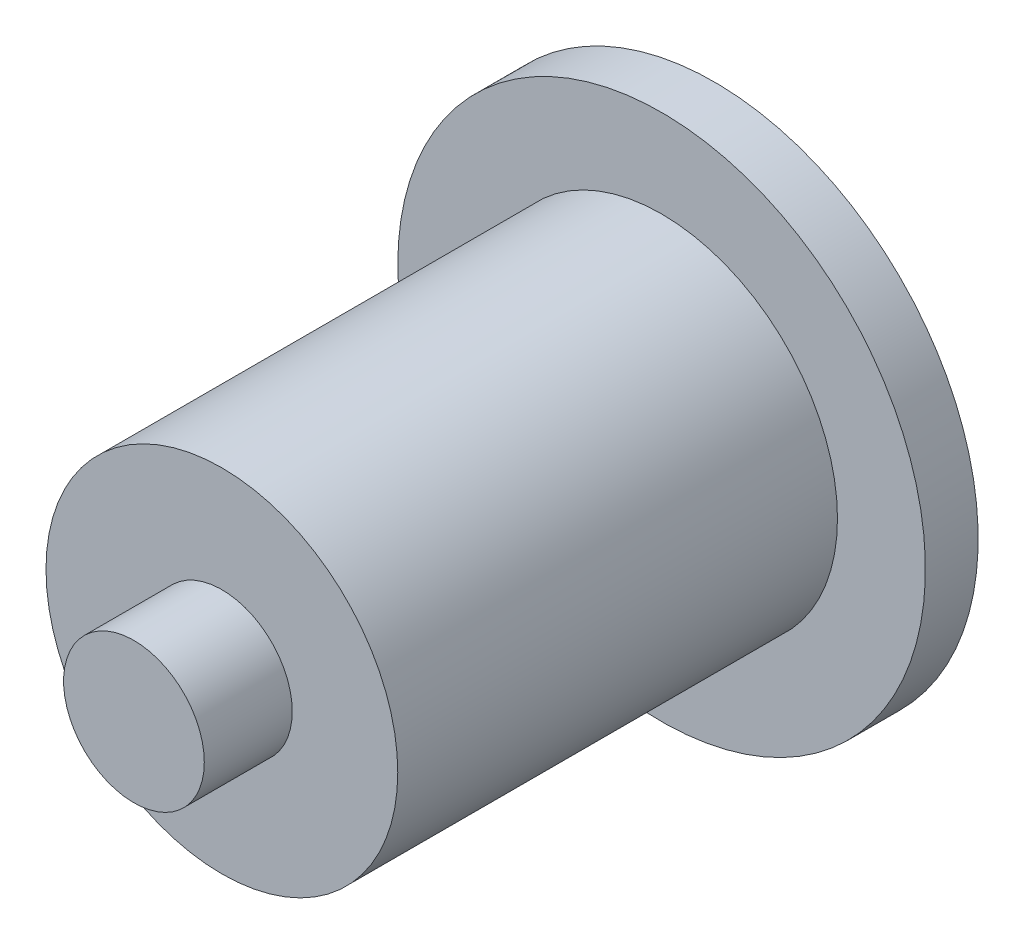
ISO-10303-21;
HEADER;
FILE_DESCRIPTION(('STEP AP214'),'2;1');
FILE_NAME('part.step','',(''),(''),'','','');
FILE_SCHEMA(('AUTOMOTIVE_DESIGN { 1 0 10303 214 1 1 1 1 }'));
ENDSEC;
DATA;
#1=APPLICATION_CONTEXT('core data for automotive mechanical design processes');
#2=APPLICATION_PROTOCOL_DEFINITION('international standard','automotive_design',2000,#1);
#3=PRODUCT_CONTEXT('',#1,'mechanical');
#4=PRODUCT('Part','Part','',(#3));
#5=PRODUCT_RELATED_PRODUCT_CATEGORY('part','',(#4));
#6=PRODUCT_DEFINITION_FORMATION('','',#4);
#7=PRODUCT_DEFINITION_CONTEXT('part definition',#1,'design');
#8=PRODUCT_DEFINITION('design','',#6,#7);
#9=PRODUCT_DEFINITION_SHAPE('','',#8);
#10=(LENGTH_UNIT() NAMED_UNIT(*) SI_UNIT(.MILLI.,.METRE.));
#11=(NAMED_UNIT(*) PLANE_ANGLE_UNIT() SI_UNIT($,.RADIAN.));
#12=(NAMED_UNIT(*) SI_UNIT($,.STERADIAN.) SOLID_ANGLE_UNIT());
#13=UNCERTAINTY_MEASURE_WITH_UNIT(LENGTH_MEASURE(1.E-05),#10,'distance_accuracy_value','');
#14=(GEOMETRIC_REPRESENTATION_CONTEXT(3) GLOBAL_UNCERTAINTY_ASSIGNED_CONTEXT((#13)) GLOBAL_UNIT_ASSIGNED_CONTEXT((#10,
#11,#12)) REPRESENTATION_CONTEXT('',''));
#15=CARTESIAN_POINT('',(0.,0.,0.));
#16=DIRECTION('',(0.,0.,1.));
#17=DIRECTION('',(1.,0.,0.));
#18=AXIS2_PLACEMENT_3D('',#15,#16,#17);
#19=CARTESIAN_POINT('',(0.,0.,25.));
#20=DIRECTION('',(0.,0.,-1.));
#21=DIRECTION('',(-1.,0.,0.));
#22=AXIS2_PLACEMENT_3D('',#19,#20,#21);
#23=CYLINDRICAL_SURFACE('',#22,10.);
#24=CARTESIAN_POINT('',(0.,0.,25.));
#25=DIRECTION('',(0.,0.,1.));
#26=DIRECTION('',(1.,0.,0.));
#27=AXIS2_PLACEMENT_3D('',#24,#25,#26);
#28=CIRCLE('',#27,10.);
#29=CARTESIAN_POINT('',(10.,0.,25.));
#30=VERTEX_POINT('',#29);
#31=EDGE_CURVE('E10',#30,#30,#28,.T.);
#32=ORIENTED_EDGE('',*,*,#31,.F.);
#33=EDGE_LOOP('',(#32));
#34=FACE_BOUND('',#33,.T.);
#35=CARTESIAN_POINT('',(0.,0.,0.));
#36=DIRECTION('',(0.,0.,-1.));
#37=DIRECTION('',(-1.,0.,0.));
#38=AXIS2_PLACEMENT_3D('',#35,#36,#37);
#39=CIRCLE('',#38,10.);
#40=CARTESIAN_POINT('',(-10.,0.,0.));
#41=VERTEX_POINT('',#40);
#42=EDGE_CURVE('E45',#41,#41,#39,.T.);
#43=ORIENTED_EDGE('',*,*,#42,.F.);
#44=EDGE_LOOP('',(#43));
#45=FACE_BOUND('',#44,.T.);
#46=ADVANCED_FACE('F30',(#34,#45),#23,.T.);
#47=CARTESIAN_POINT('',(0.,0.,25.));
#48=DIRECTION('',(0.,0.,1.));
#49=DIRECTION('',(1.,0.,0.));
#50=AXIS2_PLACEMENT_3D('',#47,#48,#49);
#51=PLANE('',#50);
#52=CARTESIAN_POINT('',(0.,0.,25.));
#53=DIRECTION('',(0.,0.,1.));
#54=DIRECTION('',(1.,0.,0.));
#55=AXIS2_PLACEMENT_3D('',#52,#53,#54);
#56=CIRCLE('',#55,4.);
#57=CARTESIAN_POINT('',(4.,0.,25.));
#58=VERTEX_POINT('',#57);
#59=EDGE_CURVE('E40',#58,#58,#56,.T.);
#60=ORIENTED_EDGE('',*,*,#59,.F.);
#61=EDGE_LOOP('',(#60));
#62=FACE_BOUND('',#61,.T.);
#63=ORIENTED_EDGE('',*,*,#31,.T.);
#64=EDGE_LOOP('',(#63));
#65=FACE_BOUND('',#64,.T.);
#66=ADVANCED_FACE('F74',(#62,#65),#51,.T.);
#67=CARTESIAN_POINT('',(0.,0.,30.));
#68=DIRECTION('',(0.,0.,-1.));
#69=DIRECTION('',(-1.,0.,0.));
#70=AXIS2_PLACEMENT_3D('',#67,#68,#69);
#71=CYLINDRICAL_SURFACE('',#70,4.);
#72=CARTESIAN_POINT('',(0.,0.,30.));
#73=DIRECTION('',(0.,0.,1.));
#74=DIRECTION('',(1.,0.,0.));
#75=AXIS2_PLACEMENT_3D('',#72,#73,#74);
#76=CIRCLE('',#75,4.);
#77=CARTESIAN_POINT('',(4.,0.,30.));
#78=VERTEX_POINT('',#77);
#79=EDGE_CURVE('E36',#78,#78,#76,.T.);
#80=ORIENTED_EDGE('',*,*,#79,.F.);
#81=EDGE_LOOP('',(#80));
#82=FACE_BOUND('',#81,.T.);
#83=ORIENTED_EDGE('',*,*,#59,.T.);
#84=EDGE_LOOP('',(#83));
#85=FACE_BOUND('',#84,.T.);
#86=ADVANCED_FACE('F79',(#82,#85),#71,.T.);
#87=CARTESIAN_POINT('',(0.,0.,30.));
#88=DIRECTION('',(0.,0.,1.));
#89=DIRECTION('',(1.,0.,0.));
#90=AXIS2_PLACEMENT_3D('',#87,#88,#89);
#91=PLANE('',#90);
#92=ORIENTED_EDGE('',*,*,#79,.T.);
#93=EDGE_LOOP('',(#92));
#94=FACE_BOUND('',#93,.T.);
#95=ADVANCED_FACE('F61',(#94),#91,.T.);
#96=CARTESIAN_POINT('',(0.,0.,-3.));
#97=DIRECTION('',(0.,0.,1.));
#98=DIRECTION('',(1.,0.,0.));
#99=AXIS2_PLACEMENT_3D('',#96,#97,#98);
#100=CYLINDRICAL_SURFACE('',#99,15.);
#101=CARTESIAN_POINT('',(0.,0.,-3.));
#102=DIRECTION('',(0.,0.,-1.));
#103=DIRECTION('',(-1.,0.,0.));
#104=AXIS2_PLACEMENT_3D('',#101,#102,#103);
#105=CIRCLE('',#104,15.);
#106=CARTESIAN_POINT('',(-15.,0.,-3.));
#107=VERTEX_POINT('',#106);
#108=EDGE_CURVE('E49',#107,#107,#105,.T.);
#109=ORIENTED_EDGE('',*,*,#108,.F.);
#110=EDGE_LOOP('',(#109));
#111=FACE_BOUND('',#110,.T.);
#112=CARTESIAN_POINT('',(0.,0.,0.));
#113=DIRECTION('',(0.,0.,-1.));
#114=DIRECTION('',(-1.,0.,0.));
#115=AXIS2_PLACEMENT_3D('',#112,#113,#114);
#116=CIRCLE('',#115,15.);
#117=CARTESIAN_POINT('',(-15.,0.,0.));
#118=VERTEX_POINT('',#117);
#119=EDGE_CURVE('E50',#118,#118,#116,.T.);
#120=ORIENTED_EDGE('',*,*,#119,.T.);
#121=EDGE_LOOP('',(#120));
#122=FACE_BOUND('',#121,.T.);
#123=ADVANCED_FACE('F58',(#111,#122),#100,.T.);
#124=CARTESIAN_POINT('',(0.,0.,-3.));
#125=DIRECTION('',(0.,0.,-1.));
#126=DIRECTION('',(-1.,0.,0.));
#127=AXIS2_PLACEMENT_3D('',#124,#125,#126);
#128=PLANE('',#127);
#129=ORIENTED_EDGE('',*,*,#108,.T.);
#130=EDGE_LOOP('',(#129));
#131=FACE_BOUND('',#130,.T.);
#132=ADVANCED_FACE('F56',(#131),#128,.T.);
#133=CARTESIAN_POINT('',(0.,0.,0.));
#134=DIRECTION('',(0.,0.,-1.));
#135=DIRECTION('',(-1.,0.,0.));
#136=AXIS2_PLACEMENT_3D('',#133,#134,#135);
#137=PLANE('',#136);
#138=ORIENTED_EDGE('',*,*,#42,.T.);
#139=EDGE_LOOP('',(#138));
#140=FACE_BOUND('',#139,.T.);
#141=ORIENTED_EDGE('',*,*,#119,.F.);
#142=EDGE_LOOP('',(#141));
#143=FACE_BOUND('',#142,.T.);
#144=ADVANCED_FACE('F65',(#140,#143),#137,.F.);
#145=CLOSED_SHELL('',(#46,#66,#86,#95,#123,#132,#144));
#146=MANIFOLD_SOLID_BREP('B2',#145);
#147=ADVANCED_BREP_SHAPE_REPRESENTATION('',(#18,#146),#14);
#148=SHAPE_DEFINITION_REPRESENTATION(#9,#147);
ENDSEC;
END-ISO-10303-21;
